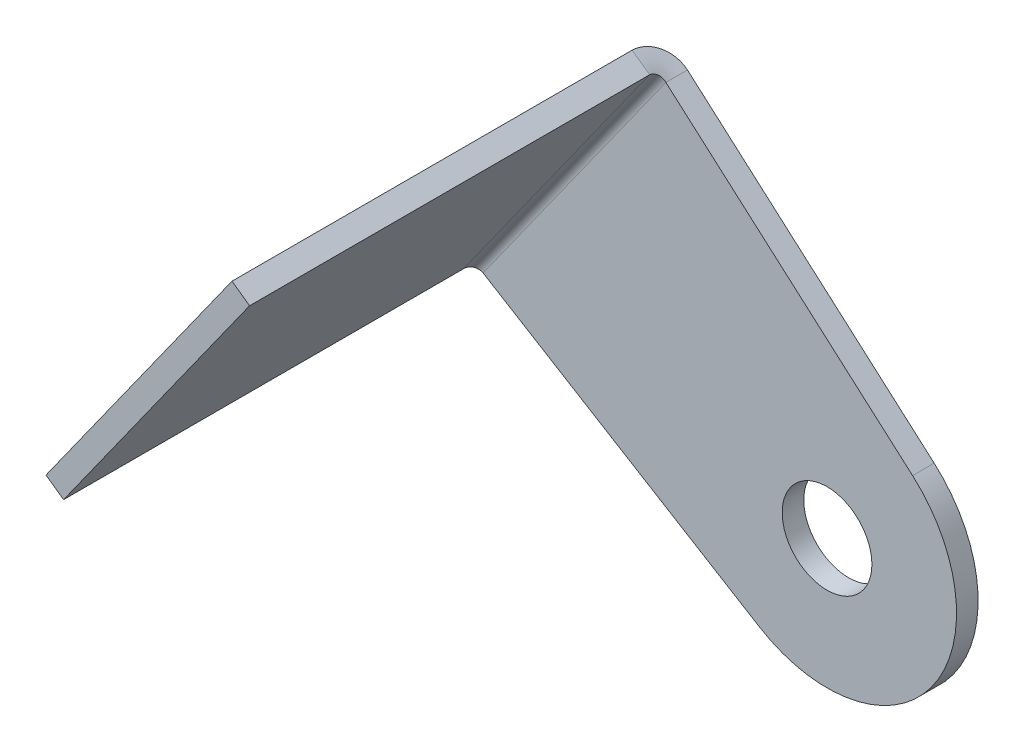
ISO-10303-21;
HEADER;
FILE_DESCRIPTION(('STEP AP214'),'2;1');
FILE_NAME('part.step','',(''),(''),'','','');
FILE_SCHEMA(('AUTOMOTIVE_DESIGN { 1 0 10303 214 1 1 1 1 }'));
ENDSEC;
DATA;
#1=APPLICATION_CONTEXT('core data for automotive mechanical design processes');
#2=APPLICATION_PROTOCOL_DEFINITION('international standard','automotive_design',2000,#1);
#3=PRODUCT_CONTEXT('',#1,'mechanical');
#4=PRODUCT('Part','Part','',(#3));
#5=PRODUCT_RELATED_PRODUCT_CATEGORY('part','',(#4));
#6=PRODUCT_DEFINITION_FORMATION('','',#4);
#7=PRODUCT_DEFINITION_CONTEXT('part definition',#1,'design');
#8=PRODUCT_DEFINITION('design','',#6,#7);
#9=PRODUCT_DEFINITION_SHAPE('','',#8);
#10=(LENGTH_UNIT() NAMED_UNIT(*) SI_UNIT(.MILLI.,.METRE.));
#11=(NAMED_UNIT(*) PLANE_ANGLE_UNIT() SI_UNIT($,.RADIAN.));
#12=(NAMED_UNIT(*) SI_UNIT($,.STERADIAN.) SOLID_ANGLE_UNIT());
#13=UNCERTAINTY_MEASURE_WITH_UNIT(LENGTH_MEASURE(1.E-05),#10,'distance_accuracy_value','');
#14=(GEOMETRIC_REPRESENTATION_CONTEXT(3) GLOBAL_UNCERTAINTY_ASSIGNED_CONTEXT((#13)) GLOBAL_UNIT_ASSIGNED_CONTEXT((#10,
#11,#12)) REPRESENTATION_CONTEXT('',''));
#15=CARTESIAN_POINT('',(0.,0.,0.));
#16=DIRECTION('',(0.,0.,1.));
#17=DIRECTION('',(1.,0.,0.));
#18=AXIS2_PLACEMENT_3D('',#15,#16,#17);
#19=CARTESIAN_POINT('',(14.0925014308631,-22.3815933924547,-1.5875));
#20=DIRECTION('',(-0.520313147207989,-0.853975543468616,0.));
#21=DIRECTION('',(0.853975543468616,-0.520313147207989,0.));
#22=AXIS2_PLACEMENT_3D('',#19,#20,#21);
#23=PLANE('',#22);
#24=DIRECTION('',(0.853975543468616,-0.520313147207989,0.));
#25=VECTOR('',#24,1.);
#26=CARTESIAN_POINT('',(14.0925014308631,-22.3815933924547,0.));
#27=LINE('',#26,#25);
#28=CARTESIAN_POINT('',(-6.25217300404447,-9.98592039559954,0.));
#29=VERTEX_POINT('',#28);
#30=CARTESIAN_POINT('',(14.0925014308631,-22.3815933924547,0.));
#31=VERTEX_POINT('',#30);
#32=EDGE_CURVE('E106',#29,#31,#27,.T.);
#33=ORIENTED_EDGE('',*,*,#32,.F.);
#34=DIRECTION('',(0.,0.,-1.));
#35=VECTOR('',#34,1.);
#36=CARTESIAN_POINT('',(-6.25217300404448,-9.98592039559955,0.));
#37=LINE('',#36,#35);
#38=CARTESIAN_POINT('',(-6.25217300404447,-9.98592039559955,-1.5875));
#39=VERTEX_POINT('',#38);
#40=EDGE_CURVE('E144',#29,#39,#37,.T.);
#41=ORIENTED_EDGE('',*,*,#40,.T.);
#42=DIRECTION('',(0.853975543468616,-0.520313147207989,0.));
#43=VECTOR('',#42,1.);
#44=CARTESIAN_POINT('',(14.0925014308631,-22.3815933924547,-1.5875));
#45=LINE('',#44,#43);
#46=CARTESIAN_POINT('',(14.0925014308631,-22.3815933924547,-1.5875));
#47=VERTEX_POINT('',#46);
#48=EDGE_CURVE('E91',#39,#47,#45,.T.);
#49=ORIENTED_EDGE('',*,*,#48,.T.);
#50=DIRECTION('',(0.,0.,1.));
#51=VECTOR('',#50,1.);
#52=CARTESIAN_POINT('',(14.0925014308631,-22.3815933924547,-1.5875));
#53=LINE('',#52,#51);
#54=EDGE_CURVE('E13',#47,#31,#53,.T.);
#55=ORIENTED_EDGE('',*,*,#54,.T.);
#56=EDGE_LOOP('',(#33,#41,#49,#55));
#57=FACE_BOUND('',#56,.T.);
#58=ADVANCED_FACE('F67',(#57),#23,.T.);
#59=CARTESIAN_POINT('',(19.0484841580192,-14.2474763409162,-1.5875));
#60=DIRECTION('',(0.,0.,-1.));
#61=DIRECTION('',(-1.,0.,0.));
#62=AXIS2_PLACEMENT_3D('',#59,#60,#61);
#63=PLANE('',#62);
#64=CARTESIAN_POINT('',(19.0484841580192,-14.2474763409162,-1.5875));
#65=DIRECTION('',(0.,0.,1.));
#66=DIRECTION('',(1.,0.,0.));
#67=AXIS2_PLACEMENT_3D('',#64,#65,#66);
#68=CIRCLE('',#67,3.29999999999998);
#69=CARTESIAN_POINT('',(22.3484841580192,-14.2474763409162,-1.5875));
#70=VERTEX_POINT('',#69);
#71=EDGE_CURVE('E123',#70,#70,#68,.T.);
#72=ORIENTED_EDGE('',*,*,#71,.T.);
#73=EDGE_LOOP('',(#72));
#74=FACE_BOUND('',#73,.T.);
#75=ORIENTED_EDGE('',*,*,#48,.F.);
#76=DIRECTION('',(-0.580445738544051,-0.814298928284971,0.));
#77=VECTOR('',#76,1.);
#78=CARTESIAN_POINT('',(-6.34954934751789,-10.1225282589454,-1.5875));
#79=LINE('',#78,#77);
#80=CARTESIAN_POINT('',(7.1926251380351,8.87559238863517,-1.5875));
#81=VERTEX_POINT('',#80);
#82=EDGE_CURVE('E155',#39,#81,#79,.F.);
#83=ORIENTED_EDGE('',*,*,#82,.T.);
#84=DIRECTION('',(-0.750672826400325,0.660674131250912,0.));
#85=VECTOR('',#84,1.);
#86=CARTESIAN_POINT('',(25.3414052581841,-7.09731766945309,-1.5875));
#87=LINE('',#86,#85);
#88=CARTESIAN_POINT('',(25.3414052581841,-7.09731766945309,-1.5875));
#89=VERTEX_POINT('',#88);
#90=EDGE_CURVE('E134',#89,#81,#87,.T.);
#91=ORIENTED_EDGE('',*,*,#90,.F.);
#92=CARTESIAN_POINT('',(19.0484841580192,-14.2474763409162,-1.5875));
#93=DIRECTION('',(0.,0.,1.));
#94=DIRECTION('',(-1.,0.,0.));
#95=AXIS2_PLACEMENT_3D('',#92,#93,#94);
#96=CIRCLE('',#95,9.525);
#97=EDGE_CURVE('E115',#47,#89,#96,.T.);
#98=ORIENTED_EDGE('',*,*,#97,.F.);
#99=EDGE_LOOP('',(#75,#83,#91,#98));
#100=FACE_BOUND('',#99,.T.);
#101=ADVANCED_FACE('F298',(#74,#100),#63,.T.);
#102=CARTESIAN_POINT('',(19.0484841580192,-14.2474763409162,0.));
#103=DIRECTION('',(0.,0.,-1.));
#104=DIRECTION('',(-1.,0.,0.));
#105=AXIS2_PLACEMENT_3D('',#102,#103,#104);
#106=PLANE('',#105);
#107=CARTESIAN_POINT('',(19.0484841580192,-14.2474763409162,0.));
#108=DIRECTION('',(0.,0.,1.));
#109=DIRECTION('',(1.,0.,0.));
#110=AXIS2_PLACEMENT_3D('',#107,#108,#109);
#111=CIRCLE('',#110,3.29999999999998);
#112=CARTESIAN_POINT('',(22.3484841580192,-14.2474763409162,0.));
#113=VERTEX_POINT('',#112);
#114=EDGE_CURVE('E129',#113,#113,#111,.T.);
#115=ORIENTED_EDGE('',*,*,#114,.F.);
#116=EDGE_LOOP('',(#115));
#117=FACE_BOUND('',#116,.T.);
#118=DIRECTION('',(-0.580445738544051,-0.814298928284971,0.));
#119=VECTOR('',#118,1.);
#120=CARTESIAN_POINT('',(-6.34954934751789,-10.1225282589454,0.));
#121=LINE('',#120,#119);
#122=CARTESIAN_POINT('',(7.19262513803511,8.87559238863516,0.));
#123=VERTEX_POINT('',#122);
#124=EDGE_CURVE('E113',#29,#123,#121,.F.);
#125=ORIENTED_EDGE('',*,*,#124,.F.);
#126=ORIENTED_EDGE('',*,*,#32,.T.);
#127=CARTESIAN_POINT('',(19.0484841580192,-14.2474763409162,0.));
#128=DIRECTION('',(0.,0.,1.));
#129=DIRECTION('',(-1.,0.,0.));
#130=AXIS2_PLACEMENT_3D('',#127,#128,#129);
#131=CIRCLE('',#130,9.525);
#132=CARTESIAN_POINT('',(25.3414052581841,-7.09731766945309,0.));
#133=VERTEX_POINT('',#132);
#134=EDGE_CURVE('E110',#31,#133,#131,.T.);
#135=ORIENTED_EDGE('',*,*,#134,.T.);
#136=DIRECTION('',(-0.750672826400325,0.660674131250912,0.));
#137=VECTOR('',#136,1.);
#138=CARTESIAN_POINT('',(25.3414052581841,-7.09731766945309,0.));
#139=LINE('',#138,#137);
#140=EDGE_CURVE('E116',#133,#123,#139,.T.);
#141=ORIENTED_EDGE('',*,*,#140,.T.);
#142=EDGE_LOOP('',(#125,#126,#135,#141));
#143=FACE_BOUND('',#142,.T.);
#144=ADVANCED_FACE('F107',(#117,#143),#106,.F.);
#145=CARTESIAN_POINT('',(19.0484841580192,-14.2474763409162,-1.5875));
#146=DIRECTION('',(0.,0.,1.));
#147=DIRECTION('',(1.,0.,0.));
#148=AXIS2_PLACEMENT_3D('',#145,#146,#147);
#149=CYLINDRICAL_SURFACE('',#148,9.525);
#150=ORIENTED_EDGE('',*,*,#134,.F.);
#151=ORIENTED_EDGE('',*,*,#54,.F.);
#152=ORIENTED_EDGE('',*,*,#97,.T.);
#153=DIRECTION('',(0.,0.,1.));
#154=VECTOR('',#153,1.);
#155=CARTESIAN_POINT('',(25.3414052581841,-7.09731766945309,-1.5875));
#156=LINE('',#155,#154);
#157=EDGE_CURVE('E71',#89,#133,#156,.T.);
#158=ORIENTED_EDGE('',*,*,#157,.T.);
#159=EDGE_LOOP('',(#150,#151,#152,#158));
#160=FACE_BOUND('',#159,.T.);
#161=ADVANCED_FACE('F69',(#160),#149,.T.);
#162=CARTESIAN_POINT('',(25.3414052581841,-7.09731766945309,-1.5875));
#163=DIRECTION('',(0.660674131250912,0.750672826400325,0.));
#164=DIRECTION('',(-0.750672826400325,0.660674131250912,0.));
#165=AXIS2_PLACEMENT_3D('',#162,#163,#164);
#166=PLANE('',#165);
#167=DIRECTION('',(0.,0.,-1.));
#168=VECTOR('',#167,1.);
#169=CARTESIAN_POINT('',(7.19262513803511,8.87559238863516,0.));
#170=LINE('',#169,#168);
#171=EDGE_CURVE('E142',#123,#81,#170,.T.);
#172=ORIENTED_EDGE('',*,*,#171,.F.);
#173=ORIENTED_EDGE('',*,*,#140,.F.);
#174=ORIENTED_EDGE('',*,*,#157,.F.);
#175=ORIENTED_EDGE('',*,*,#90,.T.);
#176=EDGE_LOOP('',(#172,#173,#174,#175));
#177=FACE_BOUND('',#176,.T.);
#178=ADVANCED_FACE('F299',(#177),#166,.T.);
#179=CARTESIAN_POINT('',(19.0484841580192,-14.2474763409162,-1.5875));
#180=DIRECTION('',(0.,0.,1.));
#181=DIRECTION('',(1.,0.,0.));
#182=AXIS2_PLACEMENT_3D('',#179,#180,#181);
#183=CYLINDRICAL_SURFACE('',#182,3.29999999999998);
#184=ORIENTED_EDGE('',*,*,#71,.F.);
#185=EDGE_LOOP('',(#184));
#186=FACE_BOUND('',#185,.T.);
#187=ORIENTED_EDGE('',*,*,#114,.T.);
#188=EDGE_LOOP('',(#187));
#189=FACE_BOUND('',#188,.T.);
#190=ADVANCED_FACE('F302',(#186,#189),#183,.F.);
#191=CARTESIAN_POINT('',(7.19262513803511,8.87559238863515,-1.603375));
#192=CARTESIAN_POINT('',(6.95471761918689,9.06963149063666,-1.603375));
#193=CARTESIAN_POINT('',(6.71699365280927,9.2635309711294,-1.54247171408694));
#194=CARTESIAN_POINT('',(6.27923617797347,9.6244723328625,-1.30803830408926));
#195=CARTESIAN_POINT('',(6.07942671033707,9.79135012296457,-1.13460041954068));
#196=CARTESIAN_POINT('',(5.74980476150962,10.0752106939996,-0.701423961073306));
#197=CARTESIAN_POINT('',(5.62013106652811,10.192094545828,-0.441855823593398));
#198=CARTESIAN_POINT('',(5.45234536907362,10.3605955613136,0.124116494296388));
#199=CARTESIAN_POINT('',(5.41430640165745,10.4121562732383,0.430242992503266));
#200=CARTESIAN_POINT('',(5.42586506568641,10.4283717557652,0.736599999999992));
#201=CARTESIAN_POINT('',(7.19262513803511,8.87559238863515,-1.5875));
#202=CARTESIAN_POINT('',(6.95641006714826,9.06842508413452,-1.5875));
#203=CARTESIAN_POINT('',(6.72037726652899,9.26111907533012,-1.52700989784483));
#204=CARTESIAN_POINT('',(6.28574645825965,9.61983169744278,-1.29416694517413));
#205=CARTESIAN_POINT('',(6.08737095301244,9.78568733544673,-1.12190570841761));
#206=CARTESIAN_POINT('',(5.76014205117202,10.0678421030262,-0.691668031893705));
#207=CARTESIAN_POINT('',(5.63142649922655,10.1840429746579,-0.43386087228001));
#208=CARTESIAN_POINT('',(5.46493590946891,10.3516208159657,0.128271741960591));
#209=CARTESIAN_POINT('',(5.4272333979072,10.4029416982096,0.432321404577514));
#210=CARTESIAN_POINT('',(5.43879206117294,10.4191571796658,0.736599999999992));
#211=CARTESIAN_POINT('',(7.19262513803511,8.87559238863516,0.));
#212=CARTESIAN_POINT('',(7.12565486328582,8.94778443391997,0.));
#213=CARTESIAN_POINT('',(7.05873863850095,9.01992949540193,0.0191717263661191));
#214=CARTESIAN_POINT('',(6.93677448687789,9.15576815547047,0.0929689463382537));
#215=CARTESIAN_POINT('',(6.88179522054982,9.21940858366301,0.1475654038895));
#216=CARTESIAN_POINT('',(6.79387101741244,9.33098300568278,0.283924886066477));
#217=CARTESIAN_POINT('',(6.76096976907071,9.37888585764804,0.365634259058794));
#218=CARTESIAN_POINT('',(6.72398994899781,9.45414628117734,0.543796508380953));
#219=CARTESIAN_POINT('',(6.71993302288154,9.48148419534191,0.640162612002354));
#220=CARTESIAN_POINT('',(6.73149160982533,9.49769956972716,0.736599999999998));
#221=CARTESIAN_POINT('',(7.19262513803511,8.87559238863516,0.0160337500000004));
#222=CARTESIAN_POINT('',(7.12736423572681,8.9465659633528,0.0160337500000004));
#223=CARTESIAN_POINT('',(7.06215608835786,9.01749348064465,0.0347881607706498));
#224=CARTESIAN_POINT('',(6.94334986996694,9.15108111369655,0.106979018842529));
#225=CARTESIAN_POINT('',(6.88981890565195,9.21368916826999,0.160387062123802));
#226=CARTESIAN_POINT('',(6.80431167997147,9.32354072879961,0.293778374537875));
#227=CARTESIAN_POINT('',(6.77237815609614,9.37075377076624,0.373709159885316));
#228=CARTESIAN_POINT('',(6.73670639479705,9.44508178837598,0.547993308521798));
#229=CARTESIAN_POINT('',(6.73298928909378,9.47217747456294,0.642261808197345));
#230=CARTESIAN_POINT('',(6.74454787526672,9.48839284786678,0.736599999999998));
#231=B_SPLINE_SURFACE_WITH_KNOTS('',1,3,((#191,#192,#193,#194,#195,#196,#197,#198,#199,#200),
(#201,#202,#203,#204,#205,#206,#207,#208,#209,#210),(#211,#212,#213,#214,#215,#216,#217,#218,
#219,#220),(#221,#222,#223,#224,#225,#226,#227,#228,#229,#230)),.UNSPECIFIED.,.F.,.F.,.F.,(2,1,
1,2),(4,2,2,2,4),(-0.01,0.,1.,1.0101),(0.,0.25,0.5,0.75,1.),.UNSPECIFIED.);
#232=DIRECTION('',(0.814298928284971,-0.580445738544051,0.));
#233=VECTOR('',#232,1.);
#234=CARTESIAN_POINT('',(5.43879206117294,10.4191571796658,0.736599999999992));
#235=LINE('',#234,#233);
#236=CARTESIAN_POINT('',(6.73149160982534,9.49769956972717,0.736599999999998));
#237=VERTEX_POINT('',#236);
#238=CARTESIAN_POINT('',(5.43879206117295,10.4191571796659,0.736599999999992));
#239=VERTEX_POINT('',#238);
#240=EDGE_CURVE('E199',#237,#239,#235,.F.);
#241=CARTESIAN_POINT('',(7.19262513803511,8.87559238863516,0.));
#242=CARTESIAN_POINT('',(7.18425529112753,8.88461484116165,-2.55665591244416E-07));
#243=CARTESIAN_POINT('',(7.17588546193472,8.89363728106075,0.000295805945613062));
#244=CARTESIAN_POINT('',(7.15916943782971,8.911665313953,0.00147872797292819));
#245=CARTESIAN_POINT('',(7.1508232429175,8.92067090694615,0.00236558838903898));
#246=CARTESIAN_POINT('',(7.13417808622475,8.93864842437533,0.0047282722774817));
#247=CARTESIAN_POINT('',(7.1258791244442,8.94762034881135,0.00620409574981368));
#248=CARTESIAN_POINT('',(7.10935190382081,8.96551379946049,0.00974106977007179));
#249=CARTESIAN_POINT('',(7.10112364497797,8.97443532567361,0.0118022203179979));
#250=CARTESIAN_POINT('',(7.08476113379439,8.99221136871098,0.0165049045919643));
#251=CARTESIAN_POINT('',(7.07662688145366,9.00106588553523,0.0191464383180046));
#252=CARTESIAN_POINT('',(7.06047545927343,9.01869146084117,0.0250035194757939));
#253=CARTESIAN_POINT('',(7.05245828943394,9.02746251932285,0.0282190669075427));
#254=CARTESIAN_POINT('',(7.03656382648685,9.04490492983922,0.0352164304917682));
#255=CARTESIAN_POINT('',(7.02868653337924,9.05357628187389,0.0389982466442449));
#256=CARTESIAN_POINT('',(7.0130942810726,9.07080327164942,0.0471190365281298));
#257=CARTESIAN_POINT('',(7.00537932187357,9.07935890939026,0.051458010259538));
#258=CARTESIAN_POINT('',(6.99013380350527,9.09633874148214,0.0606826624448345));
#259=CARTESIAN_POINT('',(6.98260324433598,9.10476293583317,0.0655683408987227));
#260=CARTESIAN_POINT('',(6.96774814790686,9.12146446871211,0.0758746324718211));
#261=CARTESIAN_POINT('',(6.96042361064702,9.12974180724002,0.0812952455910312));
#262=CARTESIAN_POINT('',(6.94600168359316,9.14613456982686,0.0926583477709724));
#263=CARTESIAN_POINT('',(6.93890429379914,9.1542499938858,0.0986008368317035));
#264=CARTESIAN_POINT('',(6.92495724001477,9.17030425895527,0.110993374915896));
#265=CARTESIAN_POINT('',(6.91810757602441,9.17824309996581,0.117443423939358));
#266=CARTESIAN_POINT('',(6.90467595539215,9.19392995576303,0.130835543216532));
#267=CARTESIAN_POINT('',(6.89809399875024,9.2016779705497,0.137777613470244));
#268=CARTESIAN_POINT('',(6.88521712942918,9.21696939044082,0.152137051152469));
#269=CARTESIAN_POINT('',(6.87892221675002,9.22451279554527,0.159554418580982));
#270=CARTESIAN_POINT('',(6.86663808045473,9.23938170553621,0.174846581525032));
#271=CARTESIAN_POINT('',(6.8606488568386,9.2467072104227,0.182721377040569));
#272=CARTESIAN_POINT('',(6.84899400733788,9.26112755438273,0.198909425086505));
#273=CARTESIAN_POINT('',(6.8433283814533,9.26822239345626,0.207222677616905));
#274=CARTESIAN_POINT('',(6.83233785650896,9.28216919588952,0.224267612339072));
#275=CARTESIAN_POINT('',(6.82701295744919,9.28902115924923,0.232999294530839));
#276=CARTESIAN_POINT('',(6.81672019440696,9.30247058546285,0.250860053188533));
#277=CARTESIAN_POINT('',(6.8117523304245,9.30906804831676,0.259989129654459));
#278=CARTESIAN_POINT('',(6.80218908566061,9.32199746184077,0.278622684115656));
#279=CARTESIAN_POINT('',(6.79759370487917,9.32832941251087,0.288127162110926));
#280=CARTESIAN_POINT('',(6.78878997729636,9.34071742963141,0.30748862251082));
#281=CARTESIAN_POINT('',(6.78458163049499,9.34677349608186,0.317345604915445));
#282=CARTESIAN_POINT('',(6.77656558925272,9.35860003735638,0.337388327800076));
#283=CARTESIAN_POINT('',(6.77275789481183,9.36437051218045,0.347574068280081));
#284=CARTESIAN_POINT('',(6.76555581146375,9.37561685081118,0.368249768974463));
#285=CARTESIAN_POINT('',(6.76216142255655,9.38109271461783,0.378739729188839));
#286=CARTESIAN_POINT('',(6.75579760776203,9.39174152156482,0.399998598119099));
#287=CARTESIAN_POINT('',(6.75282818187472,9.39691446470517,0.410767506834983));
#288=CARTESIAN_POINT('',(6.74732492682475,9.40694985043897,0.432558329523524));
#289=CARTESIAN_POINT('',(6.74479109766211,9.41181229303243,0.443580243496181));
#290=CARTESIAN_POINT('',(6.74016862040642,9.42121984579295,0.465850523943567));
#291=CARTESIAN_POINT('',(6.73807997231338,9.42576495596001,0.477098890418296));
#292=CARTESIAN_POINT('',(6.73435636894671,9.43453177655173,0.499794977564281));
#293=CARTESIAN_POINT('',(6.73272141367308,9.4387534869764,0.511242698235538));
#294=CARTESIAN_POINT('',(6.72991261513823,9.44686821955991,0.534309915233185));
#295=CARTESIAN_POINT('',(6.728738771877,9.45076124171877,0.545929411559577));
#296=CARTESIAN_POINT('',(6.72685850409994,9.45821410222712,0.569312187406931));
#297=CARTESIAN_POINT('',(6.7261520795841,9.46177394057662,0.581075466927894));
#298=CARTESIAN_POINT('',(6.72521183595234,9.46855673633317,0.604717470677943));
#299=CARTESIAN_POINT('',(6.72497801683643,9.47177969374022,0.61659619490703));
#300=CARTESIAN_POINT('',(6.72498700981497,9.47788585794763,0.640440470125327));
#301=CARTESIAN_POINT('',(6.72522982190941,9.48076906474799,0.652406021114537));
#302=CARTESIAN_POINT('',(6.72619503808378,9.48619361725257,0.67639512775195));
#303=CARTESIAN_POINT('',(6.72691744216371,9.48873496295679,0.688418683400153));
#304=CARTESIAN_POINT('',(6.72884333715722,9.49347472771659,0.712494818780691));
#305=CARTESIAN_POINT('',(6.73004682807081,9.49567314677216,0.724547398513026));
#306=CARTESIAN_POINT('',(6.73149160982533,9.49769956972716,0.736599999999998));
#307=B_SPLINE_CURVE_WITH_KNOTS('',3,(#241,#242,#243,#244,#245,#246,#247,#248,#249,#250,#251,
#252,#253,#254,#255,#256,#257,#258,#259,#260,#261,#262,#263,#264,#265,#266,#267,#268,#269,#270,
#271,#272,#273,#274,#275,#276,#277,#278,#279,#280,#281,#282,#283,#284,#285,#286,#287,#288,#289,
#290,#291,#292,#293,#294,#295,#296,#297,#298,#299,#300,#301,#302,#303,#304,#305,#306),
.UNSPECIFIED.,.F.,.F.,(4,2,2,2,2,2,2,2,2,2,2,2,2,2,2,2,2,2,2,2,2,2,2,2,2,2,2,2,2,2,2,2,4),(0.,
0.0369170115611367,0.0738340231222712,0.110751034683408,0.147668046244543,0.18458505780568,
0.221502069366815,0.258419080927949,0.295336092489087,0.332253104050222,0.369170115611356,
0.40608712717249,0.443004138733627,0.479921150294764,0.516838161855901,0.553755173417033,
0.59067218497817,0.627589196539305,0.664506208100444,0.701423219661578,0.738340231222713,
0.77525724278385,0.812174254344986,0.84909126590612,0.886008277467254,0.922925289028393,
0.959842300589527,0.996759312150663,1.0336763237118,1.07059333527293,1.10751034683407,
1.14442735839521,1.18134436995634),.UNSPECIFIED.);
#308=EDGE_CURVE('E156',#123,#237,#307,.T.);
#309=CARTESIAN_POINT('',(7.19262513803511,8.87559238863516,-1.5875));
#310=CARTESIAN_POINT('',(7.16310352286484,8.8996921712726,-1.58750080666902));
#311=CARTESIAN_POINT('',(7.13358196358775,8.92379191406846,-1.58656668124057));
#312=CARTESIAN_POINT('',(7.07461341526373,8.97193824476727,-1.58283435829231));
#313=CARTESIAN_POINT('',(7.04516642621681,8.99598483267022,-1.58003616077252));
#314=CARTESIAN_POINT('',(6.98642147679699,9.04397177837346,-1.57258148574519));
#315=CARTESIAN_POINT('',(6.95712351642408,9.06791213617375,-1.56792500823766));
#316=CARTESIAN_POINT('',(6.89875067563692,9.11563383669171,-1.55676524538064));
#317=CARTESIAN_POINT('',(6.86967579522266,9.13941517940938,-1.55026196003115));
#318=CARTESIAN_POINT('',(6.8118226411163,9.1867664386695,-1.53542418033915));
#319=CARTESIAN_POINT('',(6.7830443674242,9.21033635521196,-1.52708968599664));
#320=CARTESIAN_POINT('',(6.72585723551805,9.2572128628367,-1.50860958510224));
#321=CARTESIAN_POINT('',(6.69744837730401,9.280519453919,-1.49846397855034));
#322=CARTESIAN_POINT('',(6.64107199608169,9.32681804505251,-1.47638609000011));
#323=CARTESIAN_POINT('',(6.61310447307341,9.34981004510372,-1.46445380800178));
#324=CARTESIAN_POINT('',(6.55768161852704,9.39542894665836,-1.43883131578194));
#325=CARTESIAN_POINT('',(6.53022628698894,9.41805584816179,-1.42514110556042));
#326=CARTESIAN_POINT('',(6.4758974377997,9.46289492461114,-1.39603573745854));
#327=CARTESIAN_POINT('',(6.44902392014856,9.48510709955706,-1.38062057957817));
#328=CARTESIAN_POINT('',(6.39592691949157,9.52906809400697,-1.34810245271822));
#329=CARTESIAN_POINT('',(6.36970343648574,9.55081691351097,-1.33099948373864));
#330=CARTESIAN_POINT('',(6.31797315989209,9.59380368445307,-1.29514693720538));
#331=CARTESIAN_POINT('',(6.29246636630428,9.61504163589116,-1.2763973596517));
#332=CARTESIAN_POINT('',(6.24223439675056,9.65696038880432,-1.23729676535157));
#333=CARTESIAN_POINT('',(6.21750922078465,9.67764119027937,-1.21694574860513));
#334=CARTESIAN_POINT('',(6.16890353169362,9.7184007035921,-1.17469130329956));
#335=CARTESIAN_POINT('',(6.1450230185685,9.73847941542979,-1.15278787474044));
#336=CARTESIAN_POINT('',(6.09816766551109,9.77799126028019,-1.1074813730879));
#337=CARTESIAN_POINT('',(6.0751928255788,9.79742439329291,-1.08407829999449));
#338=CARTESIAN_POINT('',(6.03020764741305,9.83560314656172,-1.03582888932619));
#339=CARTESIAN_POINT('',(6.0081973091796,9.8543487668178,-1.01098255175131));
#340=CARTESIAN_POINT('',(5.96519763934846,9.89111221692012,-0.959906469123614));
#341=CARTESIAN_POINT('',(5.94420830775077,9.90913004676636,-0.9336767240708));
#342=CARTESIAN_POINT('',(5.9033046964337,9.9443993917066,-0.879897016240516));
#343=CARTESIAN_POINT('',(5.8833904167143,9.96165090680061,-0.852347053463044));
#344=CARTESIAN_POINT('',(5.84468836450218,9.99535094401339,-0.795993280456872));
#345=CARTESIAN_POINT('',(5.82590059200945,10.0117994661322,-0.767189470228171));
#346=CARTESIAN_POINT('',(5.78950029574448,10.0438587736518,-0.708397393221292));
#347=CARTESIAN_POINT('',(5.77188777197224,10.0594695590528,-0.678409126443115));
#348=CARTESIAN_POINT('',(5.73788388336484,10.0898206675753,-0.617320380698621));
#349=CARTESIAN_POINT('',(5.72149251852968,10.104560990697,-0.586219901732304));
#350=CARTESIAN_POINT('',(5.68997391613468,10.1331405461191,-0.522981655389418));
#351=CARTESIAN_POINT('',(5.67484667857484,10.1469797784197,-0.490843888012849));
#352=CARTESIAN_POINT('',(5.64589625367355,10.1737286944657,-0.425608487546093));
#353=CARTESIAN_POINT('',(5.63207306633209,10.1866383782113,-0.392510854455906));
#354=CARTESIAN_POINT('',(5.60576752324637,10.2115019787725,-0.325435457658706));
#355=CARTESIAN_POINT('',(5.59328516750211,10.2234558955881,-0.291457693951694));
#356=CARTESIAN_POINT('',(5.56969483878282,10.2463840464594,-0.222703891330953));
#357=CARTESIAN_POINT('',(5.55858686580779,10.2573582805151,-0.187927852417225));
#358=CARTESIAN_POINT('',(5.53777554288769,10.2783055101086,-0.117661277902195));
#359=CARTESIAN_POINT('',(5.52807219294262,10.2882785056464,-0.082170742300893));
#360=CARTESIAN_POINT('',(5.51009697212061,10.3072041147763,-0.0105606742368356));
#361=CARTESIAN_POINT('',(5.50182510124368,10.3161567283684,0.0255588582259195));
#362=CARTESIAN_POINT('',(5.48673624739104,10.3330248874034,0.0983399049598766));
#363=CARTESIAN_POINT('',(5.47991926441533,10.3409404328464,0.135001419231079));
#364=CARTESIAN_POINT('',(5.46776008519502,10.3557202713684,0.208778108542558));
#365=CARTESIAN_POINT('',(5.46241788895042,10.3625845644475,0.245893283582835));
#366=CARTESIAN_POINT('',(5.4532246479817,10.3752502331491,0.320487881621784));
#367=CARTESIAN_POINT('',(5.44937360325758,10.3810516087718,0.357967304620456));
#368=CARTESIAN_POINT('',(5.44317536745579,10.3915823882753,0.433200104016118));
#369=CARTESIAN_POINT('',(5.44082817637813,10.3963117921562,0.470953480413108));
#370=CARTESIAN_POINT('',(5.43764698962527,10.4046919692181,0.546643247907014));
#371=CARTESIAN_POINT('',(5.43681299395007,10.408342742399,0.584579639003929));
#372=CARTESIAN_POINT('',(5.43666291450589,10.4145622960592,0.660543997187351));
#373=CARTESIAN_POINT('',(5.43734683073692,10.4171310765384,0.698571964273857));
#374=CARTESIAN_POINT('',(5.43879206117294,10.4191571796658,0.736599999999992));
#375=B_SPLINE_CURVE_WITH_KNOTS('',3,(#309,#310,#311,#312,#313,#314,#315,#316,#317,#318,#319,
#320,#321,#322,#323,#324,#325,#326,#327,#328,#329,#330,#331,#332,#333,#334,#335,#336,#337,#338,
#339,#340,#341,#342,#343,#344,#345,#346,#347,#348,#349,#350,#351,#352,#353,#354,#355,#356,#357,
#358,#359,#360,#361,#362,#363,#364,#365,#366,#367,#368,#369,#370,#371,#372,#373,#374),
.UNSPECIFIED.,.F.,.F.,(4,2,2,2,2,2,2,2,2,2,2,2,2,2,2,2,2,2,2,2,2,2,2,2,2,2,2,2,2,2,2,2,4),(0.,
0.114316613315112,0.228633226630222,0.342949839945335,0.457266453260442,0.571583066575557,
0.685899679890667,0.800216293205775,0.914532906520887,1.028849519836,1.14316613315111,
1.25748274646622,1.37179935978133,1.48611597309644,1.60043258641155,1.71474919972666,
1.82906581304178,1.94338242635689,2.057699039672,2.17201565298711,2.28633226630222,
2.40064887961733,2.51496549293244,2.62928210624755,2.74359871956266,2.85791533287777,
2.97223194619288,3.08654855950799,3.20086517282311,3.31518178613822,3.42949839945333,
3.54381501276844,3.65813162608355),.UNSPECIFIED.);
#376=EDGE_CURVE('E83',#81,#239,#375,.T.);
#377=ORIENTED_EDGE('',*,*,#240,.F.);
#378=ORIENTED_EDGE('',*,*,#308,.F.);
#379=ORIENTED_EDGE('',*,*,#171,.T.);
#380=ORIENTED_EDGE('',*,*,#376,.T.);
#381=EDGE_LOOP('',(#377,#378,#379,#380));
#382=FACE_BOUND('',#381,.T.);
#383=ADVANCED_FACE('F293',(#382),#231,.F.);
#384=CARTESIAN_POINT('',(-8.25498848223152,-8.76429974189579,0.736599999999992));
#385=CARTESIAN_POINT('',(-8.24687232669724,-8.7529137047273,0.430242876510064));
#386=CARTESIAN_POINT('',(-8.18916561120458,-8.77688281744305,0.124116494296387));
#387=CARTESIAN_POINT('',(-7.98203734611036,-8.89019071402424,-0.4418558235934));
#388=CARTESIAN_POINT('',(-7.832692367309,-8.97947800640041,-0.701423961073307));
#389=CARTESIAN_POINT('',(-7.46372785084183,-9.20814545853109,-1.13460041954069));
#390=CARTESIAN_POINT('',(-7.24424709938556,-9.34742668918096,-1.30803830408926));
#391=CARTESIAN_POINT('',(-6.76714705691004,-9.65317493200968,-1.54247171408694));
#392=CARTESIAN_POINT('',(-6.50975543690907,-9.8194827459657,-1.603375));
#393=CARTESIAN_POINT('',(-6.25217300404447,-9.98592039559955,-1.603375));
#394=CARTESIAN_POINT('',(-8.24206148674499,-8.77351431799518,0.736599999999992));
#395=CARTESIAN_POINT('',(-8.23394533148112,-8.76212828120603,0.432321286237854));
#396=CARTESIAN_POINT('',(-8.17657507080929,-8.78585756279093,0.128271741960591));
#397=CARTESIAN_POINT('',(-7.97074191341192,-8.89824228519434,-0.433860872280012));
#398=CARTESIAN_POINT('',(-7.82235507764659,-8.98684659737384,-0.691668031893705));
#399=CARTESIAN_POINT('',(-7.45578360816645,-9.21380824604893,-1.12190570841761));
#400=CARTESIAN_POINT('',(-7.23773681909938,-9.35206732460069,-1.29416694517413));
#401=CARTESIAN_POINT('',(-6.76376344319032,-9.65558682780896,-1.52700989784483));
#402=CARTESIAN_POINT('',(-6.50806298982478,-9.8206891496558,-1.5875));
#403=CARTESIAN_POINT('',(-6.25217300404447,-9.98592039559955,-1.5875));
#404=CARTESIAN_POINT('',(-6.9493619380926,-9.69497192793386,0.736599999999997));
#405=CARTESIAN_POINT('',(-6.94124580986927,-9.6835859290795,0.640162259016786));
#406=CARTESIAN_POINT('',(-6.91752103128039,-9.68333209757929,0.543796508380951));
#407=CARTESIAN_POINT('',(-6.84119864356777,-9.70339940220421,0.365634259058793));
#408=CARTESIAN_POINT('',(-6.78862611140618,-9.72370569471728,0.283924886066475));
#409=CARTESIAN_POINT('',(-6.66135934062908,-9.78008699783267,0.147565403889499));
#410=CARTESIAN_POINT('',(-6.58670879048114,-9.81613086657301,0.0929689463382518));
#411=CARTESIAN_POINT('',(-6.42540207121837,-9.89677640773717,0.0191717263661173));
#412=CARTESIAN_POINT('',(-6.33881828139666,-9.94132951866539,0.));
#413=CARTESIAN_POINT('',(-6.25217300404447,-9.98592039559954,0.));
#414=CARTESIAN_POINT('',(-6.93630567265121,-9.70427864979424,0.736599999999997));
#415=CARTESIAN_POINT('',(-6.92818954470099,-9.69289265132302,0.642261452841853));
#416=CARTESIAN_POINT('',(-6.90480458548115,-9.69239659038066,0.547993308521797));
#417=CARTESIAN_POINT('',(-6.82979025654235,-9.71153148908601,0.373709159885315));
#418=CARTESIAN_POINT('',(-6.77818544884716,-9.73114797160045,0.293778374537873));
#419=CARTESIAN_POINT('',(-6.65333565552695,-9.78580641322568,0.1603870621238));
#420=CARTESIAN_POINT('',(-6.5801334073921,-9.82081790834693,0.106979018842527));
#421=CARTESIAN_POINT('',(-6.42198462136145,-9.89921242249444,0.0347881607706479));
#422=CARTESIAN_POINT('',(-6.33710890984153,-9.94254798639239,0.0160337499999987));
#423=CARTESIAN_POINT('',(-6.25217300404447,-9.98592039559954,0.0160337499999988));
#424=B_SPLINE_SURFACE_WITH_KNOTS('',1,3,((#384,#385,#386,#387,#388,#389,#390,#391,#392,#393),
(#394,#395,#396,#397,#398,#399,#400,#401,#402,#403),(#404,#405,#406,#407,#408,#409,#410,#411,
#412,#413),(#414,#415,#416,#417,#418,#419,#420,#421,#422,#423)),.UNSPECIFIED.,.F.,.F.,.F.,(2,1,
1,2),(4,2,2,2,4),(-0.01,0.,1.,1.0101),(0.,0.25,0.5,0.75,1.),.UNSPECIFIED.);
#425=CARTESIAN_POINT('',(-6.9493619380926,-9.69497192793386,0.736599999999997));
#426=CARTESIAN_POINT('',(-6.94834780936964,-9.69354878095734,0.724547398513025));
#427=CARTESIAN_POINT('',(-6.94709238980575,-9.69229763008139,0.71249481878069));
#428=CARTESIAN_POINT('',(-6.9441004638443,-9.69013825497813,0.688418683400152));
#429=CARTESIAN_POINT('',(-6.94236395744674,-9.68923003075083,0.676395127751949));
#430=CARTESIAN_POINT('',(-6.93841135266614,-9.68775544339236,0.652406021114536));
#431=CARTESIAN_POINT('',(-6.9361952542831,-9.6871890802612,0.640440470125326));
#432=CARTESIAN_POINT('',(-6.93128642630667,-9.68639610460556,0.616596194907029));
#433=CARTESIAN_POINT('',(-6.92859369671328,-9.68616949208108,0.604717470677942));
#434=CARTESIAN_POINT('',(-6.92273563212656,-9.68605314797459,0.581075466927892));
#435=CARTESIAN_POINT('',(-6.91957029713324,-9.68616341639257,0.56931218740693));
#436=CARTESIAN_POINT('',(-6.91277220840121,-9.68671713703788,0.545929411559576));
#437=CARTESIAN_POINT('',(-6.9091394546625,-9.6871605892652,0.534309915233184));
#438=CARTESIAN_POINT('',(-6.90141283517269,-9.68837618198567,0.511242698235536));
#439=CARTESIAN_POINT('',(-6.89731896942157,-9.68914832247881,0.499794977564281));
#440=CARTESIAN_POINT('',(-6.88867754509993,-9.69101600320749,0.477098890418295));
#441=CARTESIAN_POINT('',(-6.88412998652941,-9.69211154344302,0.465850523943565));
#442=CARTESIAN_POINT('',(-6.87458968831876,-9.69461995634049,0.443580243496179));
#443=CARTESIAN_POINT('',(-6.86959694867863,-9.69603282900242,0.432558329523522));
#444=CARTESIAN_POINT('',(-6.8591758726737,-9.69916907487318,0.410767506834981));
#445=CARTESIAN_POINT('',(-6.8537475363089,-9.700892448082,0.399998598119098));
#446=CARTESIAN_POINT('',(-6.84246590055942,-9.70464211516595,0.378739729188838));
#447=CARTESIAN_POINT('',(-6.83661260117474,-9.70666840904108,0.368249768974461));
#448=CARTESIAN_POINT('',(-6.82449269687169,-9.71101560780875,0.347574068280079));
#449=CARTESIAN_POINT('',(-6.81822609195331,-9.7133365127013,0.337388327800074));
#450=CARTESIAN_POINT('',(-6.80529222975608,-9.71826391411278,0.317345604915443));
#451=CARTESIAN_POINT('',(-6.79862497247723,-9.7208704106317,0.307488622510818));
#452=CARTESIAN_POINT('',(-6.78490342393945,-9.72635928788919,0.288127162110924));
#453=CARTESIAN_POINT('',(-6.77784913268054,-9.72924166862777,0.278622684115655));
#454=CARTESIAN_POINT('',(-6.76336806696167,-9.73527194228873,0.259989129654458));
#455=CARTESIAN_POINT('',(-6.75594129250173,-9.7384198352111,0.250860053188531));
#456=CARTESIAN_POINT('',(-6.74073070850453,-9.74497012156168,0.232999294530837));
#457=CARTESIAN_POINT('',(-6.73294689896729,-9.74837251498987,0.22426761233907));
#458=CARTESIAN_POINT('',(-6.71703855306797,-9.75542017756007,0.207222677616904));
#459=CARTESIAN_POINT('',(-6.70891401670591,-9.75906544670209,0.198909425086503));
#460=CARTESIAN_POINT('',(-6.69234134625023,-9.76658665079907,0.182721377040567));
#461=CARTESIAN_POINT('',(-6.68389321215662,-9.77046258575404,0.174846581525031));
#462=CARTESIAN_POINT('',(-6.66669125490636,-9.77843235588193,0.159554418580981));
#463=CARTESIAN_POINT('',(-6.65793743174972,-9.78252619105485,0.152137051152468));
#464=CARTESIAN_POINT('',(-6.64014274147369,-9.79091847108292,0.137777613470242));
#465=CARTESIAN_POINT('',(-6.6311018743543,-9.79521691593807,0.13083554321653));
#466=CARTESIAN_POINT('',(-6.61275243276707,-9.80400463187223,0.117443423939356));
#467=CARTESIAN_POINT('',(-6.60344385829923,-9.80849390295125,0.110993374915894));
#468=CARTESIAN_POINT('',(-6.58457898355989,-9.81764902815768,0.0986008368317011));
#469=CARTESIAN_POINT('',(-6.57502268328839,-9.82231488228509,0.0926583477709704));
#470=CARTESIAN_POINT('',(-6.55568293527957,-9.83180850500889,0.0812952455910294));
#471=CARTESIAN_POINT('',(-6.54589948754225,-9.83663627360527,0.0758746324718191));
#472=CARTESIAN_POINT('',(-6.52612657015816,-9.84643866662116,0.0655683408987208));
#473=CARTESIAN_POINT('',(-6.51613710051139,-9.85141329104067,0.0606826624448328));
#474=CARTESIAN_POINT('',(-6.49597376118812,-9.8614939832695,0.0514580102595363));
#475=CARTESIAN_POINT('',(-6.48579989151161,-9.86660005107882,0.0471190365281279));
#476=CARTESIAN_POINT('',(-6.46528981825,-9.87692790099129,0.0389982466442428));
#477=CARTESIAN_POINT('',(-6.45495361466491,-9.88214968309445,0.0352164304917662));
#478=CARTESIAN_POINT('',(-6.43414133076285,-9.89269295374777,0.0282190669075408));
#479=CARTESIAN_POINT('',(-6.42366525044588,-9.89801444229793,0.0250035194757921));
#480=CARTESIAN_POINT('',(-6.40259600731068,-9.90874087774082,0.0191464383180028));
#481=CARTESIAN_POINT('',(-6.39200284449247,-9.91414582463354,0.0165049045919623));
#482=CARTESIAN_POINT('',(-6.37072251235393,-9.92502272780786,0.0118022203179959));
#483=CARTESIAN_POINT('',(-6.36003534303361,-9.93049468408946,0.00974106977006997));
#484=CARTESIAN_POINT('',(-6.33859030145526,-9.94148899487555,0.00620409574981202));
#485=CARTESIAN_POINT('',(-6.32783242919722,-9.94701134938005,0.00472827227747998));
#486=CARTESIAN_POINT('',(-6.3062694515495,-9.95808972694617,0.00236558838903712));
#487=CARTESIAN_POINT('',(-6.29546434615981,-9.9636457500078,0.00147872797292631));
#488=CARTESIAN_POINT('',(-6.27383050109983,-9.97477464303701,0.00029580594561129));
#489=CARTESIAN_POINT('',(-6.26300176142954,-9.98034751300458,-2.55665592926221E-07));
#490=CARTESIAN_POINT('',(-6.25217300404447,-9.98592039559954,0.));
#491=B_SPLINE_CURVE_WITH_KNOTS('',3,(#425,#426,#427,#428,#429,#430,#431,#432,#433,#434,#435,
#436,#437,#438,#439,#440,#441,#442,#443,#444,#445,#446,#447,#448,#449,#450,#451,#452,#453,#454,
#455,#456,#457,#458,#459,#460,#461,#462,#463,#464,#465,#466,#467,#468,#469,#470,#471,#472,#473,
#474,#475,#476,#477,#478,#479,#480,#481,#482,#483,#484,#485,#486,#487,#488,#489,#490),
.UNSPECIFIED.,.F.,.F.,(4,2,2,2,2,2,2,2,2,2,2,2,2,2,2,2,2,2,2,2,2,2,2,2,2,2,2,2,2,2,2,2,4),(0.,
0.0365322586662807,0.0730645173325614,0.109596775998842,0.146129034665123,0.182661293331403,
0.219193551997684,0.255725810663964,0.292258069330245,0.328790327996526,0.365322586662807,
0.401854845329087,0.438387103995367,0.474919362661649,0.511451621327929,0.547983879994209,
0.58451613866049,0.62104839732677,0.657580655993051,0.694112914659332,0.730645173325613,
0.767177431991893,0.803709690658174,0.840241949324455,0.876774207990735,0.913306466657016,
0.949838725323297,0.986370983989577,1.02290324265586,1.05943550132214,1.09596775998842,
1.1325000186547,1.16903227732098),.UNSPECIFIED.);
#492=CARTESIAN_POINT('',(-6.9493619380926,-9.69497192793386,0.736599999999996));
#493=VERTEX_POINT('',#492);
#494=EDGE_CURVE('E157',#493,#29,#491,.T.);
#495=DIRECTION('',(0.814298928284971,-0.580445738544051,0.));
#496=VECTOR('',#495,1.);
#497=CARTESIAN_POINT('',(-6.9493619380926,-9.69497192793386,0.736599999999996));
#498=LINE('',#497,#496);
#499=CARTESIAN_POINT('',(-8.24206148674499,-8.77351431799518,0.736599999999991));
#500=VERTEX_POINT('',#499);
#501=EDGE_CURVE('E207',#493,#500,#498,.F.);
#502=CARTESIAN_POINT('',(-8.24206148674499,-8.77351431799518,0.736599999999993));
#503=CARTESIAN_POINT('',(-8.24104780670353,-8.77209085119106,0.698571964273858));
#504=CARTESIAN_POINT('',(-8.23927281245707,-8.77121006173876,0.660543997187352));
#505=CARTESIAN_POINT('',(-8.23420491205794,-8.7705304755359,0.58457963900393));
#506=CARTESIAN_POINT('',(-8.23091200590525,-8.77073167878535,0.546643247907014));
#507=CARTESIAN_POINT('',(-8.22281299819742,-8.77221271598416,0.470953480413108));
#508=CARTESIAN_POINT('',(-8.21800689664228,-8.77349254993351,0.433200104016118));
#509=CARTESIAN_POINT('',(-8.20689083988553,-8.77712418957399,0.357967304620456));
#510=CARTESIAN_POINT('',(-8.20058088468393,-8.77947599526512,0.320487881621784));
#511=CARTESIAN_POINT('',(-8.18646982276024,-8.78524252410376,0.245893283582835));
#512=CARTESIAN_POINT('',(-8.17866871603816,-8.78865724725127,0.208778108542557));
#513=CARTESIAN_POINT('',(-8.16159171586288,-8.79653794591025,0.135001419231078));
#514=CARTESIAN_POINT('',(-8.15231582240969,-8.80100392142172,0.0983399049598761));
#515=CARTESIAN_POINT('',(-8.13230914760208,-8.81097294059371,0.0255588582259191));
#516=CARTESIAN_POINT('',(-8.12157836624766,-8.81647598425423,-0.0105606742368361));
#517=CARTESIAN_POINT('',(-8.09868532447069,-8.82850245352108,-0.0821707423008938));
#518=CARTESIAN_POINT('',(-8.08652306404814,-8.83502587912741,-0.117661277902196));
#519=CARTESIAN_POINT('',(-8.06079392017307,-8.84907396885787,-0.187927852417227));
#520=CARTESIAN_POINT('',(-8.04722703672056,-8.85659863298199,-0.222703891330955));
#521=CARTESIAN_POINT('',(-8.0187188870463,-8.87262764399025,-0.291457693951695));
#522=CARTESIAN_POINT('',(-8.00377762082456,-8.88113199087437,-0.325435457658707));
#523=CARTESIAN_POINT('',(-7.97255425678388,-8.89909645157252,-0.392510854455907));
#524=CARTESIAN_POINT('',(-7.95627215896494,-8.90855656538654,-0.425608487546094));
#525=CARTESIAN_POINT('',(-7.92240391310867,-8.92840634156954,-0.490843888012851));
#526=CARTESIAN_POINT('',(-7.90481776507136,-8.93879600393853,-0.52298165538942));
#527=CARTESIAN_POINT('',(-7.86838134172139,-8.96047641949766,-0.586219901732306));
#528=CARTESIAN_POINT('',(-7.84953106640875,-8.97176717268778,-0.617320380698622));
#529=CARTESIAN_POINT('',(-7.81060935684638,-8.9952191413473,-0.678409126443117));
#530=CARTESIAN_POINT('',(-7.79053792259666,-9.00738035681669,-0.708397393221294));
#531=CARTESIAN_POINT('',(-7.74921980537672,-9.03254052447332,-0.767189470228173));
#532=CARTESIAN_POINT('',(-7.72797312240651,-9.04553947666057,-0.795993280456874));
#533=CARTESIAN_POINT('',(-7.68435324923942,-9.0723403740103,-0.852347053463046));
#534=CARTESIAN_POINT('',(-7.66198005904254,-9.08614231917278,-0.879897016240517));
#535=CARTESIAN_POINT('',(-7.6161586267705,-9.11451252424998,-0.933676724070802));
#536=CARTESIAN_POINT('',(-7.59271038469533,-9.12908078416469,-0.959906469123617));
#537=CARTESIAN_POINT('',(-7.54479289390923,-9.15894509440396,-1.01098255175131));
#538=CARTESIAN_POINT('',(-7.52032364519829,-9.17424114472852,-1.03582888932619));
#539=CARTESIAN_POINT('',(-7.47042064607758,-9.20552075813428,-1.08407829999449));
#540=CARTESIAN_POINT('',(-7.44498689566781,-9.22150432121548,-1.1074813730879));
#541=CARTESIAN_POINT('',(-7.39321372165543,-9.25411702620283,-1.15278787474044));
#542=CARTESIAN_POINT('',(-7.36687429805283,-9.27074616810899,-1.17469130329957));
#543=CARTESIAN_POINT('',(-7.31335078800683,-9.30460654155868,-1.21694574860513));
#544=CARTESIAN_POINT('',(-7.28616670156344,-9.32183777310221,-1.23729676535157));
#545=CARTESIAN_POINT('',(-7.23101691105475,-9.35685738615232,-1.2763973596517));
#546=CARTESIAN_POINT('',(-7.20305120698946,-9.37464576765889,-1.29514693720538));
#547=CARTESIAN_POINT('',(-7.14640310944085,-9.41073339873794,-1.33099948373865));
#548=CARTESIAN_POINT('',(-7.11772071595753,-9.42903264831041,-1.34810245271822));
#549=CARTESIAN_POINT('',(-7.05970589434558,-9.46609450289728,-1.38062057957817));
#550=CARTESIAN_POINT('',(-7.03037346621695,-9.48485710791167,-1.39603573745854));
#551=CARTESIAN_POINT('',(-6.97112679607275,-9.52279704449797,-1.42514110556043));
#552=CARTESIAN_POINT('',(-6.94121255405716,-9.54197437606987,-1.43883131578194));
#553=CARTESIAN_POINT('',(-6.88087187855583,-9.58069413776147,-1.46445380800178));
#554=CARTESIAN_POINT('',(-6.85044544507007,-9.60023656788116,-1.47638609000011));
#555=CARTESIAN_POINT('',(-6.78915124289279,-9.63963601915162,-1.49846397855034));
#556=CARTESIAN_POINT('',(-6.75828347420126,-9.65949304030239,-1.50860958510224));
#557=CARTESIAN_POINT('',(-6.69617852134015,-9.69947040806409,-1.52708968599664));
#558=CARTESIAN_POINT('',(-6.66494133717056,-9.71959075467502,-1.53542418033915));
#559=CARTESIAN_POINT('',(-6.60217036210923,-9.76004287407209,-1.55026196003115));
#560=CARTESIAN_POINT('',(-6.57063657121749,-9.78037464685824,-1.55676524538064));
#561=CARTESIAN_POINT('',(-6.50734590947536,-9.82119720751315,-1.56792500823766));
#562=CARTESIAN_POINT('',(-6.47558903862497,-9.84168799538192,-1.57258148574519));
#563=CARTESIAN_POINT('',(-6.41192626825018,-9.8827758012221,-1.58003616077252));
#564=CARTESIAN_POINT('',(-6.38002036872578,-9.90337281919353,-1.58283435829232));
#565=CARTESIAN_POINT('',(-6.31613399944681,-9.94462001002929,-1.58656668124057));
#566=CARTESIAN_POINT('',(-6.28415352969223,-9.96527018289363,-1.58750080666902));
#567=CARTESIAN_POINT('',(-6.25217300404447,-9.98592039559955,-1.5875));
#568=B_SPLINE_CURVE_WITH_KNOTS('',3,(#502,#503,#504,#505,#506,#507,#508,#509,#510,#511,#512,
#513,#514,#515,#516,#517,#518,#519,#520,#521,#522,#523,#524,#525,#526,#527,#528,#529,#530,#531,
#532,#533,#534,#535,#536,#537,#538,#539,#540,#541,#542,#543,#544,#545,#546,#547,#548,#549,#550,
#551,#552,#553,#554,#555,#556,#557,#558,#559,#560,#561,#562,#563,#564,#565,#566,#567),
.UNSPECIFIED.,.F.,.F.,(4,2,2,2,2,2,2,2,2,2,2,2,2,2,2,2,2,2,2,2,2,2,2,2,2,2,2,2,2,2,2,2,4),(0.,
0.114192943129125,0.228385886258251,0.342578829387376,0.456771772516501,0.570964715645626,
0.685157658774752,0.799350601903877,0.913543545033002,1.02773648816213,1.14192943129125,
1.25612237442038,1.3703153175495,1.48450826067863,1.59870120380775,1.71289414693688,
1.827087090066,1.94128003319513,2.05547297632426,2.16966591945338,2.28385886258251,
2.39805180571163,2.51224474884076,2.62643769196988,2.74063063509901,2.85482357822813,
2.96901652135726,3.08320946448638,3.19740240761551,3.31159535074463,3.42578829387376,
3.53998123700288,3.65417418013201),.UNSPECIFIED.);
#569=EDGE_CURVE('E149',#500,#39,#568,.T.);
#570=ORIENTED_EDGE('',*,*,#494,.F.);
#571=ORIENTED_EDGE('',*,*,#501,.T.);
#572=ORIENTED_EDGE('',*,*,#569,.T.);
#573=ORIENTED_EDGE('',*,*,#40,.F.);
#574=EDGE_LOOP('',(#570,#571,#572,#573));
#575=FACE_BOUND('',#574,.T.);
#576=ADVANCED_FACE('F171',(#575),#424,.F.);
#577=CARTESIAN_POINT('',(-6.3495493475179,-10.1225282589454,0.736599999999999));
#578=DIRECTION('',(-0.580445738544051,-0.814298928284971,0.));
#579=DIRECTION('',(-0.814298928284971,0.580445738544051,0.));
#580=AXIS2_PLACEMENT_3D('',#577,#578,#579);
#581=CYLINDRICAL_SURFACE('',#580,2.3241);
#582=ORIENTED_EDGE('',*,*,#82,.F.);
#583=ORIENTED_EDGE('',*,*,#569,.F.);
#584=DIRECTION('',(-0.580445738544051,-0.814298928284971,0.));
#585=VECTOR('',#584,1.);
#586=CARTESIAN_POINT('',(5.43879206117294,10.4191571796658,0.736599999999992));
#587=LINE('',#586,#585);
#588=EDGE_CURVE('E211',#500,#239,#587,.F.);
#589=ORIENTED_EDGE('',*,*,#588,.T.);
#590=ORIENTED_EDGE('',*,*,#376,.F.);
#591=EDGE_LOOP('',(#582,#583,#589,#590));
#592=FACE_BOUND('',#591,.T.);
#593=ADVANCED_FACE('F161',(#592),#581,.T.);
#594=CARTESIAN_POINT('',(-6.3495493475179,-10.1225282589454,0.736599999999999));
#595=DIRECTION('',(-0.580445738544051,-0.814298928284971,0.));
#596=DIRECTION('',(-0.814298928284971,0.580445738544051,0.));
#597=AXIS2_PLACEMENT_3D('',#594,#595,#596);
#598=CYLINDRICAL_SURFACE('',#597,0.7366);
#599=ORIENTED_EDGE('',*,*,#124,.T.);
#600=ORIENTED_EDGE('',*,*,#308,.T.);
#601=DIRECTION('',(-0.580445738544051,-0.814298928284971,0.));
#602=VECTOR('',#601,1.);
#603=CARTESIAN_POINT('',(6.73149160982533,9.49769956972716,0.736599999999998));
#604=LINE('',#603,#602);
#605=EDGE_CURVE('E203',#237,#493,#604,.T.);
#606=ORIENTED_EDGE('',*,*,#605,.T.);
#607=ORIENTED_EDGE('',*,*,#494,.T.);
#608=EDGE_LOOP('',(#599,#600,#606,#607));
#609=FACE_BOUND('',#608,.T.);
#610=ADVANCED_FACE('F170',(#609),#598,.F.);
#611=CARTESIAN_POINT('',(-8.24206148674508,-8.77351431799512,30.1625));
#612=DIRECTION('',(0.580445738544051,0.814298928284971,0.));
#613=DIRECTION('',(-0.814298928284971,0.580445738544051,0.));
#614=AXIS2_PLACEMENT_3D('',#611,#612,#613);
#615=PLANE('',#614);
#616=ORIENTED_EDGE('',*,*,#501,.F.);
#617=DIRECTION('',(0.,0.,-1.));
#618=VECTOR('',#617,1.);
#619=CARTESIAN_POINT('',(-6.94936193809269,-9.69497192793381,30.1625));
#620=LINE('',#619,#618);
#621=CARTESIAN_POINT('',(-6.94936193809269,-9.69497192793381,30.1625));
#622=VERTEX_POINT('',#621);
#623=EDGE_CURVE('E214',#493,#622,#620,.F.);
#624=ORIENTED_EDGE('',*,*,#623,.T.);
#625=DIRECTION('',(0.814298928284971,-0.580445738544051,0.));
#626=VECTOR('',#625,1.);
#627=CARTESIAN_POINT('',(-8.24206148674508,-8.77351431799512,30.1625));
#628=LINE('',#627,#626);
#629=CARTESIAN_POINT('',(-8.24206148674508,-8.77351431799512,30.1625));
#630=VERTEX_POINT('',#629);
#631=EDGE_CURVE('E242',#630,#622,#628,.T.);
#632=ORIENTED_EDGE('',*,*,#631,.F.);
#633=DIRECTION('',(0.,0.,1.));
#634=VECTOR('',#633,1.);
#635=CARTESIAN_POINT('',(-8.24206148674499,-8.77351431799518,0.));
#636=LINE('',#635,#634);
#637=EDGE_CURVE('E226',#500,#630,#636,.T.);
#638=ORIENTED_EDGE('',*,*,#637,.F.);
#639=EDGE_LOOP('',(#616,#624,#632,#638));
#640=FACE_BOUND('',#639,.T.);
#641=ADVANCED_FACE('F172',(#640),#615,.F.);
#642=CARTESIAN_POINT('',(5.43879206117294,10.4191571796658,0.));
#643=DIRECTION('',(-0.580445738544051,-0.814298928284971,0.));
#644=DIRECTION('',(0.814298928284971,-0.580445738544051,0.));
#645=AXIS2_PLACEMENT_3D('',#642,#643,#644);
#646=PLANE('',#645);
#647=ORIENTED_EDGE('',*,*,#240,.T.);
#648=DIRECTION('',(0.,0.,-1.));
#649=VECTOR('',#648,1.);
#650=CARTESIAN_POINT('',(5.43879206117294,10.4191571796658,0.));
#651=LINE('',#650,#649);
#652=CARTESIAN_POINT('',(5.43879206117285,10.4191571796659,30.1625));
#653=VERTEX_POINT('',#652);
#654=EDGE_CURVE('E234',#653,#239,#651,.T.);
#655=ORIENTED_EDGE('',*,*,#654,.F.);
#656=DIRECTION('',(0.814298928284971,-0.580445738544051,0.));
#657=VECTOR('',#656,1.);
#658=CARTESIAN_POINT('',(5.43879206117285,10.4191571796659,30.1625));
#659=LINE('',#658,#657);
#660=CARTESIAN_POINT('',(6.73149160982524,9.49769956972722,30.1625));
#661=VERTEX_POINT('',#660);
#662=EDGE_CURVE('E238',#653,#661,#659,.T.);
#663=ORIENTED_EDGE('',*,*,#662,.T.);
#664=DIRECTION('',(0.,0.,1.));
#665=VECTOR('',#664,1.);
#666=CARTESIAN_POINT('',(6.73149160982533,9.49769956972716,0.));
#667=LINE('',#666,#665);
#668=EDGE_CURVE('E222',#661,#237,#667,.F.);
#669=ORIENTED_EDGE('',*,*,#668,.T.);
#670=EDGE_LOOP('',(#647,#655,#663,#669));
#671=FACE_BOUND('',#670,.T.);
#672=ADVANCED_FACE('F280',(#671),#646,.F.);
#673=CARTESIAN_POINT('',(-1.31831156058511,0.93971427547697,0.));
#674=DIRECTION('',(0.814298928284971,-0.580445738544051,0.));
#675=DIRECTION('',(0.580445738544051,0.814298928284971,0.));
#676=AXIS2_PLACEMENT_3D('',#673,#674,#675);
#677=PLANE('',#676);
#678=ORIENTED_EDGE('',*,*,#588,.F.);
#679=ORIENTED_EDGE('',*,*,#637,.T.);
#680=DIRECTION('',(0.580445738544051,0.814298928284971,0.));
#681=VECTOR('',#680,1.);
#682=CARTESIAN_POINT('',(-1.31831156058519,0.939714275477031,30.1625));
#683=LINE('',#682,#681);
#684=EDGE_CURVE('E230',#630,#653,#683,.T.);
#685=ORIENTED_EDGE('',*,*,#684,.T.);
#686=ORIENTED_EDGE('',*,*,#654,.T.);
#687=EDGE_LOOP('',(#678,#679,#685,#686));
#688=FACE_BOUND('',#687,.T.);
#689=ADVANCED_FACE('F285',(#688),#677,.F.);
#690=CARTESIAN_POINT('',(-0.0256120119327184,0.018256665538289,0.));
#691=DIRECTION('',(0.814298928284971,-0.580445738544051,0.));
#692=DIRECTION('',(0.580445738544051,0.814298928284971,0.));
#693=AXIS2_PLACEMENT_3D('',#690,#691,#692);
#694=PLANE('',#693);
#695=ORIENTED_EDGE('',*,*,#623,.F.);
#696=ORIENTED_EDGE('',*,*,#605,.F.);
#697=ORIENTED_EDGE('',*,*,#668,.F.);
#698=DIRECTION('',(-0.580445738544051,-0.814298928284971,0.));
#699=VECTOR('',#698,1.);
#700=CARTESIAN_POINT('',(6.73149160982524,9.49769956972722,30.1625));
#701=LINE('',#700,#699);
#702=EDGE_CURVE('E218',#622,#661,#701,.F.);
#703=ORIENTED_EDGE('',*,*,#702,.F.);
#704=EDGE_LOOP('',(#695,#696,#697,#703));
#705=FACE_BOUND('',#704,.T.);
#706=ADVANCED_FACE('F269',(#705),#694,.T.);
#707=CARTESIAN_POINT('',(5.43879206117285,10.4191571796659,30.1625));
#708=DIRECTION('',(0.,0.,-1.));
#709=DIRECTION('',(-1.,0.,0.));
#710=AXIS2_PLACEMENT_3D('',#707,#708,#709);
#711=PLANE('',#710);
#712=ORIENTED_EDGE('',*,*,#702,.T.);
#713=ORIENTED_EDGE('',*,*,#662,.F.);
#714=ORIENTED_EDGE('',*,*,#684,.F.);
#715=ORIENTED_EDGE('',*,*,#631,.T.);
#716=EDGE_LOOP('',(#712,#713,#714,#715));
#717=FACE_BOUND('',#716,.T.);
#718=ADVANCED_FACE('F274',(#717),#711,.F.);
#719=CLOSED_SHELL('',(#58,#101,#144,#161,#178,#190,#383,#576,#593,#610,#641,#672,#689,#706,#718));
#720=MANIFOLD_SOLID_BREP('B2',#719);
#721=ADVANCED_BREP_SHAPE_REPRESENTATION('',(#18,#720),#14);
#722=SHAPE_DEFINITION_REPRESENTATION(#9,#721);
ENDSEC;
END-ISO-10303-21;
